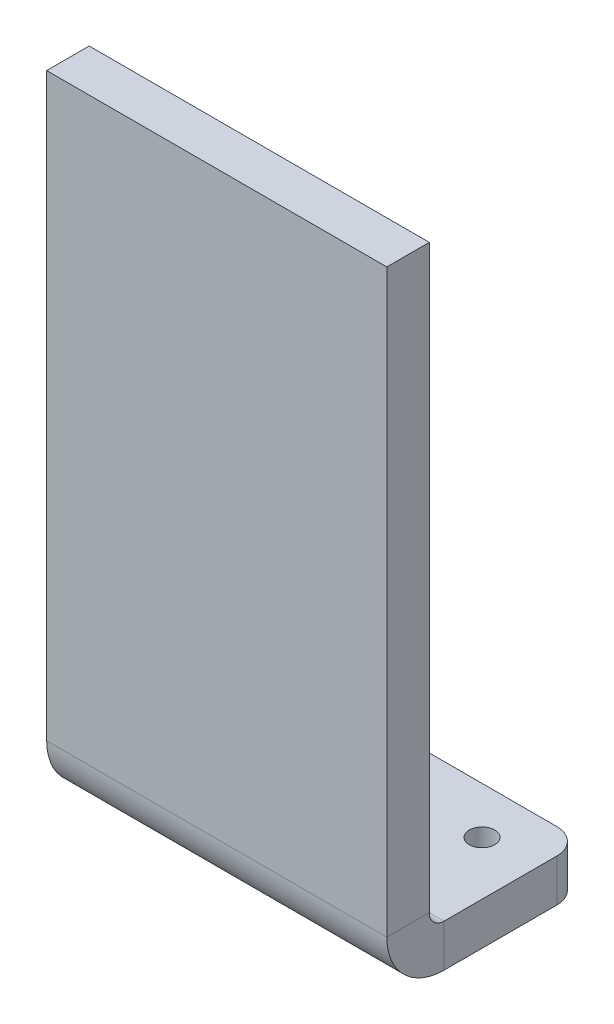
ISO-10303-21;
HEADER;
FILE_DESCRIPTION(('STEP AP214'),'2;1');
FILE_NAME('part.step','',(''),(''),'','','');
FILE_SCHEMA(('AUTOMOTIVE_DESIGN { 1 0 10303 214 1 1 1 1 }'));
ENDSEC;
DATA;
#1=APPLICATION_CONTEXT('core data for automotive mechanical design processes');
#2=APPLICATION_PROTOCOL_DEFINITION('international standard','automotive_design',2000,#1);
#3=PRODUCT_CONTEXT('',#1,'mechanical');
#4=PRODUCT('Part','Part','',(#3));
#5=PRODUCT_RELATED_PRODUCT_CATEGORY('part','',(#4));
#6=PRODUCT_DEFINITION_FORMATION('','',#4);
#7=PRODUCT_DEFINITION_CONTEXT('part definition',#1,'design');
#8=PRODUCT_DEFINITION('design','',#6,#7);
#9=PRODUCT_DEFINITION_SHAPE('','',#8);
#10=(LENGTH_UNIT() NAMED_UNIT(*) SI_UNIT(.MILLI.,.METRE.));
#11=(NAMED_UNIT(*) PLANE_ANGLE_UNIT() SI_UNIT($,.RADIAN.));
#12=(NAMED_UNIT(*) SI_UNIT($,.STERADIAN.) SOLID_ANGLE_UNIT());
#13=UNCERTAINTY_MEASURE_WITH_UNIT(LENGTH_MEASURE(1.E-05),#10,'distance_accuracy_value','');
#14=(GEOMETRIC_REPRESENTATION_CONTEXT(3) GLOBAL_UNCERTAINTY_ASSIGNED_CONTEXT((#13)) GLOBAL_UNIT_ASSIGNED_CONTEXT((#10,
#11,#12)) REPRESENTATION_CONTEXT('',''));
#15=CARTESIAN_POINT('',(0.,0.,0.));
#16=DIRECTION('',(0.,0.,1.));
#17=DIRECTION('',(1.,0.,0.));
#18=AXIS2_PLACEMENT_3D('',#15,#16,#17);
#19=CARTESIAN_POINT('',(13.7,70.,5.49999999999996));
#20=DIRECTION('',(0.,-1.,0.));
#21=DIRECTION('',(0.,0.,-1.));
#22=AXIS2_PLACEMENT_3D('',#19,#20,#21);
#23=CYLINDRICAL_SURFACE('',#22,1.5);
#24=CARTESIAN_POINT('',(13.7,0.,5.49999999999996));
#25=DIRECTION('',(0.,1.,0.));
#26=DIRECTION('',(0.,0.,1.));
#27=AXIS2_PLACEMENT_3D('',#24,#25,#26);
#28=CIRCLE('',#27,1.5);
#29=CARTESIAN_POINT('',(13.7,0.,6.99999999999996));
#30=VERTEX_POINT('',#29);
#31=EDGE_CURVE('E208',#30,#30,#28,.T.);
#32=ORIENTED_EDGE('',*,*,#31,.T.);
#33=EDGE_LOOP('',(#32));
#34=FACE_BOUND('',#33,.T.);
#35=CARTESIAN_POINT('',(13.7,-4.,5.49999999999996));
#36=DIRECTION('',(0.,-1.,0.));
#37=DIRECTION('',(0.,0.,-1.));
#38=AXIS2_PLACEMENT_3D('',#35,#36,#37);
#39=CIRCLE('',#38,1.5);
#40=CARTESIAN_POINT('',(13.7,-4.,3.99999999999995));
#41=VERTEX_POINT('',#40);
#42=EDGE_CURVE('E43',#41,#41,#39,.F.);
#43=ORIENTED_EDGE('',*,*,#42,.F.);
#44=EDGE_LOOP('',(#43));
#45=FACE_BOUND('',#44,.T.);
#46=ADVANCED_FACE('F39',(#34,#45),#23,.F.);
#47=CARTESIAN_POINT('',(-13.7,70.,5.49999999999996));
#48=DIRECTION('',(0.,-1.,0.));
#49=DIRECTION('',(0.,0.,-1.));
#50=AXIS2_PLACEMENT_3D('',#47,#48,#49);
#51=CYLINDRICAL_SURFACE('',#50,1.5);
#52=CARTESIAN_POINT('',(-13.7,0.,5.49999999999996));
#53=DIRECTION('',(0.,1.,0.));
#54=DIRECTION('',(0.,0.,1.));
#55=AXIS2_PLACEMENT_3D('',#52,#53,#54);
#56=CIRCLE('',#55,1.5);
#57=CARTESIAN_POINT('',(-13.7,0.,6.99999999999996));
#58=VERTEX_POINT('',#57);
#59=EDGE_CURVE('E204',#58,#58,#56,.T.);
#60=ORIENTED_EDGE('',*,*,#59,.T.);
#61=EDGE_LOOP('',(#60));
#62=FACE_BOUND('',#61,.T.);
#63=CARTESIAN_POINT('',(-13.7,-4.,5.49999999999996));
#64=DIRECTION('',(0.,-1.,0.));
#65=DIRECTION('',(0.,0.,-1.));
#66=AXIS2_PLACEMENT_3D('',#63,#64,#65);
#67=CIRCLE('',#66,1.5);
#68=CARTESIAN_POINT('',(-13.7,-4.,3.99999999999995));
#69=VERTEX_POINT('',#68);
#70=EDGE_CURVE('E211',#69,#69,#67,.F.);
#71=ORIENTED_EDGE('',*,*,#70,.F.);
#72=EDGE_LOOP('',(#71));
#73=FACE_BOUND('',#72,.T.);
#74=ADVANCED_FACE('F266',(#62,#73),#51,.F.);
#75=CARTESIAN_POINT('',(-20.,-5.,18.));
#76=DIRECTION('',(0.,1.,0.));
#77=DIRECTION('',(0.,0.,1.));
#78=AXIS2_PLACEMENT_3D('',#75,#76,#77);
#79=PLANE('',#78);
#80=CARTESIAN_POINT('',(13.7,-5.,5.49999999999996));
#81=DIRECTION('',(0.,-1.,0.));
#82=DIRECTION('',(0.,0.,-1.));
#83=AXIS2_PLACEMENT_3D('',#80,#81,#82);
#84=CIRCLE('',#83,3.3);
#85=CARTESIAN_POINT('',(13.7,-5.,2.19999999999996));
#86=VERTEX_POINT('',#85);
#87=EDGE_CURVE('E235',#86,#86,#84,.T.);
#88=ORIENTED_EDGE('',*,*,#87,.F.);
#89=EDGE_LOOP('',(#88));
#90=FACE_BOUND('',#89,.T.);
#91=CARTESIAN_POINT('',(-13.7,-5.,5.49999999999996));
#92=DIRECTION('',(0.,-1.,0.));
#93=DIRECTION('',(0.,0.,-1.));
#94=AXIS2_PLACEMENT_3D('',#91,#92,#93);
#95=CIRCLE('',#94,3.29999999999999);
#96=CARTESIAN_POINT('',(-13.7,-5.,2.19999999999997));
#97=VERTEX_POINT('',#96);
#98=EDGE_CURVE('E228',#97,#97,#95,.T.);
#99=ORIENTED_EDGE('',*,*,#98,.F.);
#100=EDGE_LOOP('',(#99));
#101=FACE_BOUND('',#100,.T.);
#102=DIRECTION('',(1.,0.,0.));
#103=VECTOR('',#102,1.);
#104=CARTESIAN_POINT('',(-20.,-5.,0.));
#105=LINE('',#104,#103);
#106=CARTESIAN_POINT('',(-17.,-5.,0.));
#107=VERTEX_POINT('',#106);
#108=CARTESIAN_POINT('',(17.,-5.,0.));
#109=VERTEX_POINT('',#108);
#110=EDGE_CURVE('E186',#107,#109,#105,.T.);
#111=ORIENTED_EDGE('',*,*,#110,.T.);
#112=CARTESIAN_POINT('',(17.,-5.,3.));
#113=DIRECTION('',(0.,1.,0.));
#114=DIRECTION('',(0.,0.,1.));
#115=AXIS2_PLACEMENT_3D('',#112,#113,#114);
#116=CIRCLE('',#115,3.);
#117=CARTESIAN_POINT('',(20.,-5.,3.));
#118=VERTEX_POINT('',#117);
#119=EDGE_CURVE('E219',#109,#118,#116,.F.);
#120=ORIENTED_EDGE('',*,*,#119,.T.);
#121=DIRECTION('',(0.,0.,-1.));
#122=VECTOR('',#121,1.);
#123=CARTESIAN_POINT('',(20.,-5.,18.));
#124=LINE('',#123,#122);
#125=CARTESIAN_POINT('',(20.,-5.,16.2634));
#126=VERTEX_POINT('',#125);
#127=EDGE_CURVE('E201',#126,#118,#124,.T.);
#128=ORIENTED_EDGE('',*,*,#127,.F.);
#129=DIRECTION('',(1.,0.,0.));
#130=VECTOR('',#129,1.);
#131=CARTESIAN_POINT('',(20.,-5.,16.2634));
#132=LINE('',#131,#130);
#133=CARTESIAN_POINT('',(-20.,-5.,16.2634));
#134=VERTEX_POINT('',#133);
#135=EDGE_CURVE('E128',#126,#134,#132,.F.);
#136=ORIENTED_EDGE('',*,*,#135,.T.);
#137=DIRECTION('',(0.,0.,-1.));
#138=VECTOR('',#137,1.);
#139=CARTESIAN_POINT('',(-20.,-5.,18.));
#140=LINE('',#139,#138);
#141=CARTESIAN_POINT('',(-20.,-5.,3.));
#142=VERTEX_POINT('',#141);
#143=EDGE_CURVE('E194',#134,#142,#140,.T.);
#144=ORIENTED_EDGE('',*,*,#143,.T.);
#145=CARTESIAN_POINT('',(-17.,-5.,3.));
#146=DIRECTION('',(0.,1.,0.));
#147=DIRECTION('',(0.,0.,1.));
#148=AXIS2_PLACEMENT_3D('',#145,#146,#147);
#149=CIRCLE('',#148,3.);
#150=EDGE_CURVE('E217',#142,#107,#149,.F.);
#151=ORIENTED_EDGE('',*,*,#150,.T.);
#152=EDGE_LOOP('',(#111,#120,#128,#136,#144,#151));
#153=FACE_BOUND('',#152,.T.);
#154=ADVANCED_FACE('F272',(#90,#101,#153),#79,.F.);
#155=CARTESIAN_POINT('',(20.,0.,18.));
#156=DIRECTION('',(1.,0.,0.));
#157=DIRECTION('',(0.,0.,-1.));
#158=AXIS2_PLACEMENT_3D('',#155,#156,#157);
#159=PLANE('',#158);
#160=ORIENTED_EDGE('',*,*,#127,.T.);
#161=DIRECTION('',(0.,-1.,0.));
#162=VECTOR('',#161,1.);
#163=CARTESIAN_POINT('',(20.,0.,3.));
#164=LINE('',#163,#162);
#165=CARTESIAN_POINT('',(20.,0.,3.));
#166=VERTEX_POINT('',#165);
#167=EDGE_CURVE('E64',#118,#166,#164,.F.);
#168=ORIENTED_EDGE('',*,*,#167,.T.);
#169=DIRECTION('',(0.,0.,-1.));
#170=VECTOR('',#169,1.);
#171=CARTESIAN_POINT('',(20.,0.,18.));
#172=LINE('',#171,#170);
#173=CARTESIAN_POINT('',(20.,0.,16.2634));
#174=VERTEX_POINT('',#173);
#175=EDGE_CURVE('E199',#174,#166,#172,.T.);
#176=ORIENTED_EDGE('',*,*,#175,.F.);
#177=DIRECTION('',(0.,-1.,0.));
#178=VECTOR('',#177,1.);
#179=CARTESIAN_POINT('',(20.,0.,16.2634));
#180=LINE('',#179,#178);
#181=EDGE_CURVE('E175',#174,#126,#180,.T.);
#182=ORIENTED_EDGE('',*,*,#181,.T.);
#183=EDGE_LOOP('',(#160,#168,#176,#182));
#184=FACE_BOUND('',#183,.T.);
#185=ADVANCED_FACE('F307',(#184),#159,.T.);
#186=CARTESIAN_POINT('',(-20.,0.,18.));
#187=DIRECTION('',(0.,1.,0.));
#188=DIRECTION('',(0.,0.,1.));
#189=AXIS2_PLACEMENT_3D('',#186,#187,#188);
#190=PLANE('',#189);
#191=ORIENTED_EDGE('',*,*,#31,.F.);
#192=EDGE_LOOP('',(#191));
#193=FACE_BOUND('',#192,.T.);
#194=ORIENTED_EDGE('',*,*,#59,.F.);
#195=EDGE_LOOP('',(#194));
#196=FACE_BOUND('',#195,.T.);
#197=ORIENTED_EDGE('',*,*,#175,.T.);
#198=CARTESIAN_POINT('',(17.,0.,3.));
#199=DIRECTION('',(0.,1.,0.));
#200=DIRECTION('',(0.,0.,1.));
#201=AXIS2_PLACEMENT_3D('',#198,#199,#200);
#202=CIRCLE('',#201,3.);
#203=CARTESIAN_POINT('',(17.,0.,0.));
#204=VERTEX_POINT('',#203);
#205=EDGE_CURVE('E48',#166,#204,#202,.T.);
#206=ORIENTED_EDGE('',*,*,#205,.T.);
#207=DIRECTION('',(1.,0.,0.));
#208=VECTOR('',#207,1.);
#209=CARTESIAN_POINT('',(-20.,0.,0.));
#210=LINE('',#209,#208);
#211=CARTESIAN_POINT('',(-17.,0.,0.));
#212=VERTEX_POINT('',#211);
#213=EDGE_CURVE('E191',#212,#204,#210,.T.);
#214=ORIENTED_EDGE('',*,*,#213,.F.);
#215=CARTESIAN_POINT('',(-17.,0.,3.));
#216=DIRECTION('',(0.,1.,0.));
#217=DIRECTION('',(0.,0.,1.));
#218=AXIS2_PLACEMENT_3D('',#215,#216,#217);
#219=CIRCLE('',#218,3.);
#220=CARTESIAN_POINT('',(-20.,0.,3.));
#221=VERTEX_POINT('',#220);
#222=EDGE_CURVE('E56',#212,#221,#219,.T.);
#223=ORIENTED_EDGE('',*,*,#222,.T.);
#224=DIRECTION('',(0.,0.,-1.));
#225=VECTOR('',#224,1.);
#226=CARTESIAN_POINT('',(-20.,0.,18.));
#227=LINE('',#226,#225);
#228=CARTESIAN_POINT('',(-20.,0.,16.2634));
#229=VERTEX_POINT('',#228);
#230=EDGE_CURVE('E197',#229,#221,#227,.T.);
#231=ORIENTED_EDGE('',*,*,#230,.F.);
#232=DIRECTION('',(1.,0.,0.));
#233=VECTOR('',#232,1.);
#234=CARTESIAN_POINT('',(20.,0.,16.2634));
#235=LINE('',#234,#233);
#236=EDGE_CURVE('E179',#174,#229,#235,.F.);
#237=ORIENTED_EDGE('',*,*,#236,.F.);
#238=EDGE_LOOP('',(#197,#206,#214,#223,#231,#237));
#239=FACE_BOUND('',#238,.T.);
#240=ADVANCED_FACE('F303',(#193,#196,#239),#190,.T.);
#241=CARTESIAN_POINT('',(-20.,-5.,18.));
#242=DIRECTION('',(-1.,0.,0.));
#243=DIRECTION('',(0.,0.,1.));
#244=AXIS2_PLACEMENT_3D('',#241,#242,#243);
#245=PLANE('',#244);
#246=ORIENTED_EDGE('',*,*,#230,.T.);
#247=DIRECTION('',(0.,1.,0.));
#248=VECTOR('',#247,1.);
#249=CARTESIAN_POINT('',(-20.,-5.,3.));
#250=LINE('',#249,#248);
#251=EDGE_CURVE('E11',#221,#142,#250,.F.);
#252=ORIENTED_EDGE('',*,*,#251,.T.);
#253=ORIENTED_EDGE('',*,*,#143,.F.);
#254=DIRECTION('',(0.,-1.,0.));
#255=VECTOR('',#254,1.);
#256=CARTESIAN_POINT('',(-20.,0.,16.2634));
#257=LINE('',#256,#255);
#258=EDGE_CURVE('E183',#229,#134,#257,.T.);
#259=ORIENTED_EDGE('',*,*,#258,.F.);
#260=EDGE_LOOP('',(#246,#252,#253,#259));
#261=FACE_BOUND('',#260,.T.);
#262=ADVANCED_FACE('F299',(#261),#245,.T.);
#263=CARTESIAN_POINT('',(0.,0.,0.));
#264=DIRECTION('',(0.,0.,-1.));
#265=DIRECTION('',(-1.,0.,0.));
#266=AXIS2_PLACEMENT_3D('',#263,#264,#265);
#267=PLANE('',#266);
#268=ORIENTED_EDGE('',*,*,#213,.T.);
#269=DIRECTION('',(0.,-1.,0.));
#270=VECTOR('',#269,1.);
#271=CARTESIAN_POINT('',(17.,0.,0.));
#272=LINE('',#271,#270);
#273=EDGE_CURVE('E214',#204,#109,#272,.T.);
#274=ORIENTED_EDGE('',*,*,#273,.T.);
#275=ORIENTED_EDGE('',*,*,#110,.F.);
#276=DIRECTION('',(0.,1.,0.));
#277=VECTOR('',#276,1.);
#278=CARTESIAN_POINT('',(-17.,0.,0.));
#279=LINE('',#278,#277);
#280=EDGE_CURVE('E203',#107,#212,#279,.T.);
#281=ORIENTED_EDGE('',*,*,#280,.T.);
#282=EDGE_LOOP('',(#268,#274,#275,#281));
#283=FACE_BOUND('',#282,.T.);
#284=ADVANCED_FACE('F294',(#283),#267,.T.);
#285=CARTESIAN_POINT('',(-20.,1.73659999999999,16.2634));
#286=DIRECTION('',(-1.,0.,0.));
#287=DIRECTION('',(0.,0.,1.));
#288=AXIS2_PLACEMENT_3D('',#285,#286,#287);
#289=PLANE('',#288);
#290=DIRECTION('',(0.,0.,1.));
#291=VECTOR('',#290,1.);
#292=CARTESIAN_POINT('',(-20.,1.73659999999999,18.));
#293=LINE('',#292,#291);
#294=CARTESIAN_POINT('',(-20.,1.73659999999999,18.));
#295=VERTEX_POINT('',#294);
#296=CARTESIAN_POINT('',(-20.,1.73659999999999,23.));
#297=VERTEX_POINT('',#296);
#298=EDGE_CURVE('E207',#295,#297,#293,.T.);
#299=ORIENTED_EDGE('',*,*,#298,.F.);
#300=CARTESIAN_POINT('',(-20.,1.73659999999999,16.2634));
#301=DIRECTION('',(1.,0.,0.));
#302=DIRECTION('',(0.,0.,-1.));
#303=AXIS2_PLACEMENT_3D('',#300,#301,#302);
#304=CIRCLE('',#303,1.7366);
#305=EDGE_CURVE('E131',#229,#295,#304,.F.);
#306=ORIENTED_EDGE('',*,*,#305,.F.);
#307=ORIENTED_EDGE('',*,*,#258,.T.);
#308=CARTESIAN_POINT('',(-20.,1.73659999999999,16.2634));
#309=DIRECTION('',(1.,0.,0.));
#310=DIRECTION('',(0.,0.,-1.));
#311=AXIS2_PLACEMENT_3D('',#308,#309,#310);
#312=CIRCLE('',#311,6.7366);
#313=EDGE_CURVE('E174',#134,#297,#312,.F.);
#314=ORIENTED_EDGE('',*,*,#313,.T.);
#315=EDGE_LOOP('',(#299,#306,#307,#314));
#316=FACE_BOUND('',#315,.T.);
#317=ADVANCED_FACE('F244',(#316),#289,.T.);
#318=CARTESIAN_POINT('',(20.,1.73659999999999,16.2634));
#319=DIRECTION('',(-1.,0.,0.));
#320=DIRECTION('',(0.,0.,1.));
#321=AXIS2_PLACEMENT_3D('',#318,#319,#320);
#322=PLANE('',#321);
#323=CARTESIAN_POINT('',(20.,1.73659999999999,16.2634));
#324=DIRECTION('',(1.,0.,0.));
#325=DIRECTION('',(0.,0.,-1.));
#326=AXIS2_PLACEMENT_3D('',#323,#324,#325);
#327=CIRCLE('',#326,1.7366);
#328=CARTESIAN_POINT('',(20.,1.73659999999999,18.));
#329=VERTEX_POINT('',#328);
#330=EDGE_CURVE('E138',#329,#174,#327,.T.);
#331=ORIENTED_EDGE('',*,*,#330,.F.);
#332=DIRECTION('',(0.,0.,1.));
#333=VECTOR('',#332,1.);
#334=CARTESIAN_POINT('',(20.,1.73659999999999,18.));
#335=LINE('',#334,#333);
#336=CARTESIAN_POINT('',(20.,1.73659999999999,23.));
#337=VERTEX_POINT('',#336);
#338=EDGE_CURVE('E135',#329,#337,#335,.T.);
#339=ORIENTED_EDGE('',*,*,#338,.T.);
#340=CARTESIAN_POINT('',(20.,1.73659999999999,16.2634));
#341=DIRECTION('',(1.,0.,0.));
#342=DIRECTION('',(0.,0.,-1.));
#343=AXIS2_PLACEMENT_3D('',#340,#341,#342);
#344=CIRCLE('',#343,6.7366);
#345=EDGE_CURVE('E120',#337,#126,#344,.T.);
#346=ORIENTED_EDGE('',*,*,#345,.T.);
#347=ORIENTED_EDGE('',*,*,#181,.F.);
#348=EDGE_LOOP('',(#331,#339,#346,#347));
#349=FACE_BOUND('',#348,.T.);
#350=ADVANCED_FACE('F136',(#349),#322,.F.);
#351=CARTESIAN_POINT('',(20.,1.73659999999999,16.2634));
#352=DIRECTION('',(1.,0.,0.));
#353=DIRECTION('',(0.,0.,1.));
#354=AXIS2_PLACEMENT_3D('',#351,#352,#353);
#355=CYLINDRICAL_SURFACE('',#354,6.7366);
#356=ORIENTED_EDGE('',*,*,#135,.F.);
#357=ORIENTED_EDGE('',*,*,#345,.F.);
#358=DIRECTION('',(-1.,0.,0.));
#359=VECTOR('',#358,1.);
#360=CARTESIAN_POINT('',(0.,1.73659999999999,23.));
#361=LINE('',#360,#359);
#362=EDGE_CURVE('E125',#337,#297,#361,.T.);
#363=ORIENTED_EDGE('',*,*,#362,.T.);
#364=ORIENTED_EDGE('',*,*,#313,.F.);
#365=EDGE_LOOP('',(#356,#357,#363,#364));
#366=FACE_BOUND('',#365,.T.);
#367=ADVANCED_FACE('F122',(#366),#355,.T.);
#368=CARTESIAN_POINT('',(20.,1.73659999999999,16.2634));
#369=DIRECTION('',(1.,0.,0.));
#370=DIRECTION('',(0.,0.,1.));
#371=AXIS2_PLACEMENT_3D('',#368,#369,#370);
#372=CYLINDRICAL_SURFACE('',#371,1.7366);
#373=ORIENTED_EDGE('',*,*,#236,.T.);
#374=ORIENTED_EDGE('',*,*,#305,.T.);
#375=DIRECTION('',(1.,0.,0.));
#376=VECTOR('',#375,1.);
#377=CARTESIAN_POINT('',(-20.,1.73659999999999,18.));
#378=LINE('',#377,#376);
#379=EDGE_CURVE('E142',#295,#329,#378,.T.);
#380=ORIENTED_EDGE('',*,*,#379,.T.);
#381=ORIENTED_EDGE('',*,*,#330,.T.);
#382=EDGE_LOOP('',(#373,#374,#380,#381));
#383=FACE_BOUND('',#382,.T.);
#384=ADVANCED_FACE('F247',(#383),#372,.F.);
#385=CARTESIAN_POINT('',(20.,70.,23.));
#386=DIRECTION('',(-1.,0.,0.));
#387=DIRECTION('',(0.,0.,1.));
#388=AXIS2_PLACEMENT_3D('',#385,#386,#387);
#389=PLANE('',#388);
#390=ORIENTED_EDGE('',*,*,#338,.F.);
#391=DIRECTION('',(0.,1.,0.));
#392=VECTOR('',#391,1.);
#393=CARTESIAN_POINT('',(20.,70.,18.));
#394=LINE('',#393,#392);
#395=CARTESIAN_POINT('',(20.,70.,18.));
#396=VERTEX_POINT('',#395);
#397=EDGE_CURVE('E151',#329,#396,#394,.T.);
#398=ORIENTED_EDGE('',*,*,#397,.T.);
#399=DIRECTION('',(0.,0.,-1.));
#400=VECTOR('',#399,1.);
#401=CARTESIAN_POINT('',(20.,70.,23.));
#402=LINE('',#401,#400);
#403=CARTESIAN_POINT('',(20.,70.,23.));
#404=VERTEX_POINT('',#403);
#405=EDGE_CURVE('E155',#404,#396,#402,.T.);
#406=ORIENTED_EDGE('',*,*,#405,.F.);
#407=DIRECTION('',(0.,1.,0.));
#408=VECTOR('',#407,1.);
#409=CARTESIAN_POINT('',(20.,70.,23.));
#410=LINE('',#409,#408);
#411=EDGE_CURVE('E147',#337,#404,#410,.T.);
#412=ORIENTED_EDGE('',*,*,#411,.F.);
#413=EDGE_LOOP('',(#390,#398,#406,#412));
#414=FACE_BOUND('',#413,.T.);
#415=ADVANCED_FACE('F153',(#414),#389,.F.);
#416=CARTESIAN_POINT('',(-20.,0.,23.));
#417=DIRECTION('',(1.,0.,0.));
#418=DIRECTION('',(0.,0.,-1.));
#419=AXIS2_PLACEMENT_3D('',#416,#417,#418);
#420=PLANE('',#419);
#421=ORIENTED_EDGE('',*,*,#298,.T.);
#422=DIRECTION('',(0.,-1.,0.));
#423=VECTOR('',#422,1.);
#424=CARTESIAN_POINT('',(-20.,0.,23.));
#425=LINE('',#424,#423);
#426=CARTESIAN_POINT('',(-20.,70.,23.));
#427=VERTEX_POINT('',#426);
#428=EDGE_CURVE('E150',#427,#297,#425,.T.);
#429=ORIENTED_EDGE('',*,*,#428,.F.);
#430=DIRECTION('',(0.,0.,-1.));
#431=VECTOR('',#430,1.);
#432=CARTESIAN_POINT('',(-20.,70.,23.));
#433=LINE('',#432,#431);
#434=CARTESIAN_POINT('',(-20.,70.,18.));
#435=VERTEX_POINT('',#434);
#436=EDGE_CURVE('E167',#427,#435,#433,.T.);
#437=ORIENTED_EDGE('',*,*,#436,.T.);
#438=DIRECTION('',(0.,-1.,0.));
#439=VECTOR('',#438,1.);
#440=CARTESIAN_POINT('',(-20.,0.,18.));
#441=LINE('',#440,#439);
#442=EDGE_CURVE('E158',#435,#295,#441,.T.);
#443=ORIENTED_EDGE('',*,*,#442,.T.);
#444=EDGE_LOOP('',(#421,#429,#437,#443));
#445=FACE_BOUND('',#444,.T.);
#446=ADVANCED_FACE('F240',(#445),#420,.F.);
#447=CARTESIAN_POINT('',(0.,0.,23.));
#448=DIRECTION('',(0.,0.,-1.));
#449=DIRECTION('',(-1.,0.,0.));
#450=AXIS2_PLACEMENT_3D('',#447,#448,#449);
#451=PLANE('',#450);
#452=ORIENTED_EDGE('',*,*,#362,.F.);
#453=ORIENTED_EDGE('',*,*,#411,.T.);
#454=DIRECTION('',(-1.,0.,0.));
#455=VECTOR('',#454,1.);
#456=CARTESIAN_POINT('',(-20.,70.,23.));
#457=LINE('',#456,#455);
#458=EDGE_CURVE('E157',#404,#427,#457,.T.);
#459=ORIENTED_EDGE('',*,*,#458,.T.);
#460=ORIENTED_EDGE('',*,*,#428,.T.);
#461=EDGE_LOOP('',(#452,#453,#459,#460));
#462=FACE_BOUND('',#461,.T.);
#463=ADVANCED_FACE('F146',(#462),#451,.F.);
#464=CARTESIAN_POINT('',(0.,0.,18.));
#465=DIRECTION('',(0.,0.,-1.));
#466=DIRECTION('',(-1.,0.,0.));
#467=AXIS2_PLACEMENT_3D('',#464,#465,#466);
#468=PLANE('',#467);
#469=ORIENTED_EDGE('',*,*,#397,.F.);
#470=ORIENTED_EDGE('',*,*,#379,.F.);
#471=ORIENTED_EDGE('',*,*,#442,.F.);
#472=DIRECTION('',(-1.,0.,0.));
#473=VECTOR('',#472,1.);
#474=CARTESIAN_POINT('',(-20.,70.,18.));
#475=LINE('',#474,#473);
#476=EDGE_CURVE('E162',#396,#435,#475,.T.);
#477=ORIENTED_EDGE('',*,*,#476,.F.);
#478=EDGE_LOOP('',(#469,#470,#471,#477));
#479=FACE_BOUND('',#478,.T.);
#480=ADVANCED_FACE('F249',(#479),#468,.T.);
#481=CARTESIAN_POINT('',(-20.,70.,23.));
#482=DIRECTION('',(0.,-1.,0.));
#483=DIRECTION('',(0.,0.,-1.));
#484=AXIS2_PLACEMENT_3D('',#481,#482,#483);
#485=PLANE('',#484);
#486=ORIENTED_EDGE('',*,*,#476,.T.);
#487=ORIENTED_EDGE('',*,*,#436,.F.);
#488=ORIENTED_EDGE('',*,*,#458,.F.);
#489=ORIENTED_EDGE('',*,*,#405,.T.);
#490=EDGE_LOOP('',(#486,#487,#488,#489));
#491=FACE_BOUND('',#490,.T.);
#492=ADVANCED_FACE('F252',(#491),#485,.F.);
#493=CARTESIAN_POINT('',(17.,0.,3.));
#494=DIRECTION('',(0.,-1.,0.));
#495=DIRECTION('',(0.,0.,-1.));
#496=AXIS2_PLACEMENT_3D('',#493,#494,#495);
#497=CYLINDRICAL_SURFACE('',#496,3.);
#498=ORIENTED_EDGE('',*,*,#205,.F.);
#499=ORIENTED_EDGE('',*,*,#167,.F.);
#500=ORIENTED_EDGE('',*,*,#119,.F.);
#501=ORIENTED_EDGE('',*,*,#273,.F.);
#502=EDGE_LOOP('',(#498,#499,#500,#501));
#503=FACE_BOUND('',#502,.T.);
#504=ADVANCED_FACE('F255',(#503),#497,.T.);
#505=CARTESIAN_POINT('',(-17.,0.,3.));
#506=DIRECTION('',(0.,1.,0.));
#507=DIRECTION('',(0.,0.,1.));
#508=AXIS2_PLACEMENT_3D('',#505,#506,#507);
#509=CYLINDRICAL_SURFACE('',#508,3.);
#510=ORIENTED_EDGE('',*,*,#150,.F.);
#511=ORIENTED_EDGE('',*,*,#251,.F.);
#512=ORIENTED_EDGE('',*,*,#222,.F.);
#513=ORIENTED_EDGE('',*,*,#280,.F.);
#514=EDGE_LOOP('',(#510,#511,#512,#513));
#515=FACE_BOUND('',#514,.T.);
#516=ADVANCED_FACE('F41',(#515),#509,.T.);
#517=CARTESIAN_POINT('',(-13.7,-4.,5.49999999999996));
#518=DIRECTION('',(0.,-1.,0.));
#519=DIRECTION('',(0.,0.,-1.));
#520=AXIS2_PLACEMENT_3D('',#517,#518,#519);
#521=PLANE('',#520);
#522=CARTESIAN_POINT('',(-13.7,-4.,5.49999999999996));
#523=DIRECTION('',(0.,-1.,0.));
#524=DIRECTION('',(0.,0.,-1.));
#525=AXIS2_PLACEMENT_3D('',#522,#523,#524);
#526=CIRCLE('',#525,3.29999999999999);
#527=CARTESIAN_POINT('',(-13.7,-4.,2.19999999999997));
#528=VERTEX_POINT('',#527);
#529=EDGE_CURVE('E224',#528,#528,#526,.T.);
#530=ORIENTED_EDGE('',*,*,#529,.T.);
#531=EDGE_LOOP('',(#530));
#532=FACE_BOUND('',#531,.T.);
#533=ORIENTED_EDGE('',*,*,#70,.T.);
#534=EDGE_LOOP('',(#533));
#535=FACE_BOUND('',#534,.T.);
#536=ADVANCED_FACE('F328',(#532,#535),#521,.T.);
#537=CARTESIAN_POINT('',(-13.7,-4.,5.49999999999996));
#538=DIRECTION('',(0.,-1.,0.));
#539=DIRECTION('',(0.,0.,-1.));
#540=AXIS2_PLACEMENT_3D('',#537,#538,#539);
#541=CYLINDRICAL_SURFACE('',#540,3.29999999999999);
#542=ORIENTED_EDGE('',*,*,#529,.F.);
#543=EDGE_LOOP('',(#542));
#544=FACE_BOUND('',#543,.T.);
#545=ORIENTED_EDGE('',*,*,#98,.T.);
#546=EDGE_LOOP('',(#545));
#547=FACE_BOUND('',#546,.T.);
#548=ADVANCED_FACE('F277',(#544,#547),#541,.F.);
#549=CARTESIAN_POINT('',(13.7,-4.,5.49999999999996));
#550=DIRECTION('',(0.,-1.,0.));
#551=DIRECTION('',(0.,0.,-1.));
#552=AXIS2_PLACEMENT_3D('',#549,#550,#551);
#553=PLANE('',#552);
#554=CARTESIAN_POINT('',(13.7,-4.,5.49999999999996));
#555=DIRECTION('',(0.,-1.,0.));
#556=DIRECTION('',(0.,0.,-1.));
#557=AXIS2_PLACEMENT_3D('',#554,#555,#556);
#558=CIRCLE('',#557,3.3);
#559=CARTESIAN_POINT('',(13.7,-4.,2.19999999999996));
#560=VERTEX_POINT('',#559);
#561=EDGE_CURVE('E349',#560,#560,#558,.T.);
#562=ORIENTED_EDGE('',*,*,#561,.T.);
#563=EDGE_LOOP('',(#562));
#564=FACE_BOUND('',#563,.T.);
#565=ORIENTED_EDGE('',*,*,#42,.T.);
#566=EDGE_LOOP('',(#565));
#567=FACE_BOUND('',#566,.T.);
#568=ADVANCED_FACE('F335',(#564,#567),#553,.T.);
#569=CARTESIAN_POINT('',(13.7,-4.,5.49999999999996));
#570=DIRECTION('',(0.,-1.,0.));
#571=DIRECTION('',(0.,0.,-1.));
#572=AXIS2_PLACEMENT_3D('',#569,#570,#571);
#573=CYLINDRICAL_SURFACE('',#572,3.3);
#574=ORIENTED_EDGE('',*,*,#561,.F.);
#575=EDGE_LOOP('',(#574));
#576=FACE_BOUND('',#575,.T.);
#577=ORIENTED_EDGE('',*,*,#87,.T.);
#578=EDGE_LOOP('',(#577));
#579=FACE_BOUND('',#578,.T.);
#580=ADVANCED_FACE('F338',(#576,#579),#573,.F.);
#581=CLOSED_SHELL('',(#46,#74,#154,#185,#240,#262,#284,#317,#350,#367,#384,#415,#446,#463,#480,
#492,#504,#516,#536,#548,#568,#580));
#582=MANIFOLD_SOLID_BREP('B2',#581);
#583=ADVANCED_BREP_SHAPE_REPRESENTATION('',(#18,#582),#14);
#584=SHAPE_DEFINITION_REPRESENTATION(#9,#583);
ENDSEC;
END-ISO-10303-21;
